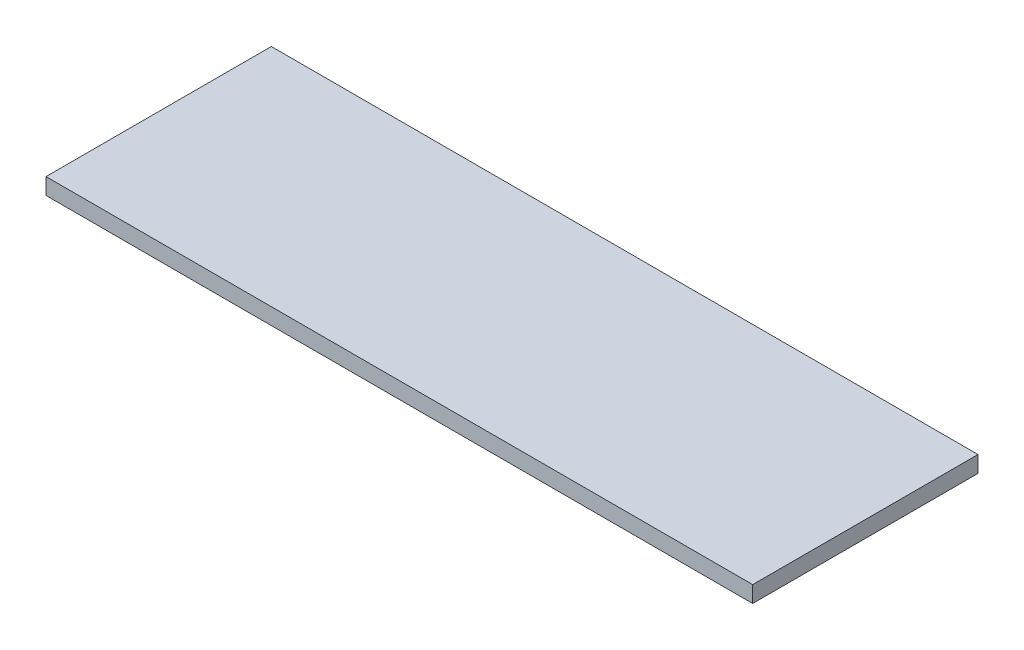
ISO-10303-21;
HEADER;
FILE_DESCRIPTION(('STEP AP214'),'2;1');
FILE_NAME('part.step','',(''),(''),'','','');
FILE_SCHEMA(('AUTOMOTIVE_DESIGN { 1 0 10303 214 1 1 1 1 }'));
ENDSEC;
DATA;
#1=APPLICATION_CONTEXT('core data for automotive mechanical design processes');
#2=APPLICATION_PROTOCOL_DEFINITION('international standard','automotive_design',2000,#1);
#3=PRODUCT_CONTEXT('',#1,'mechanical');
#4=PRODUCT('Part','Part','',(#3));
#5=PRODUCT_RELATED_PRODUCT_CATEGORY('part','',(#4));
#6=PRODUCT_DEFINITION_FORMATION('','',#4);
#7=PRODUCT_DEFINITION_CONTEXT('part definition',#1,'design');
#8=PRODUCT_DEFINITION('design','',#6,#7);
#9=PRODUCT_DEFINITION_SHAPE('','',#8);
#10=(LENGTH_UNIT() NAMED_UNIT(*) SI_UNIT(.MILLI.,.METRE.));
#11=(NAMED_UNIT(*) PLANE_ANGLE_UNIT() SI_UNIT($,.RADIAN.));
#12=(NAMED_UNIT(*) SI_UNIT($,.STERADIAN.) SOLID_ANGLE_UNIT());
#13=UNCERTAINTY_MEASURE_WITH_UNIT(LENGTH_MEASURE(1.E-05),#10,'distance_accuracy_value','');
#14=(GEOMETRIC_REPRESENTATION_CONTEXT(3) GLOBAL_UNCERTAINTY_ASSIGNED_CONTEXT((#13)) GLOBAL_UNIT_ASSIGNED_CONTEXT((#10,
#11,#12)) REPRESENTATION_CONTEXT('',''));
#15=CARTESIAN_POINT('',(0.,0.,0.));
#16=DIRECTION('',(0.,0.,1.));
#17=DIRECTION('',(1.,0.,0.));
#18=AXIS2_PLACEMENT_3D('',#15,#16,#17);
#19=CARTESIAN_POINT('',(0.,1.6,0.));
#20=DIRECTION('',(-1.,0.,0.));
#21=DIRECTION('',(0.,0.,1.));
#22=AXIS2_PLACEMENT_3D('',#19,#20,#21);
#23=PLANE('',#22);
#24=DIRECTION('',(0.,0.,-1.));
#25=VECTOR('',#24,1.);
#26=CARTESIAN_POINT('',(0.,0.,0.));
#27=LINE('',#26,#25);
#28=CARTESIAN_POINT('',(0.,0.,0.));
#29=VERTEX_POINT('',#28);
#30=CARTESIAN_POINT('',(0.,0.,-22.));
#31=VERTEX_POINT('',#30);
#32=EDGE_CURVE('E107',#29,#31,#27,.T.);
#33=ORIENTED_EDGE('',*,*,#32,.T.);
#34=DIRECTION('',(0.,-1.,0.));
#35=VECTOR('',#34,1.);
#36=CARTESIAN_POINT('',(0.,1.6,-22.));
#37=LINE('',#36,#35);
#38=CARTESIAN_POINT('',(0.,1.6,-22.));
#39=VERTEX_POINT('',#38);
#40=EDGE_CURVE('E11',#39,#31,#37,.T.);
#41=ORIENTED_EDGE('',*,*,#40,.F.);
#42=DIRECTION('',(0.,0.,-1.));
#43=VECTOR('',#42,1.);
#44=CARTESIAN_POINT('',(0.,1.6,0.));
#45=LINE('',#44,#43);
#46=CARTESIAN_POINT('',(0.,1.6,0.));
#47=VERTEX_POINT('',#46);
#48=EDGE_CURVE('E91',#47,#39,#45,.T.);
#49=ORIENTED_EDGE('',*,*,#48,.F.);
#50=DIRECTION('',(0.,-1.,0.));
#51=VECTOR('',#50,1.);
#52=CARTESIAN_POINT('',(0.,1.6,0.));
#53=LINE('',#52,#51);
#54=EDGE_CURVE('E103',#47,#29,#53,.T.);
#55=ORIENTED_EDGE('',*,*,#54,.T.);
#56=EDGE_LOOP('',(#33,#41,#49,#55));
#57=FACE_BOUND('',#56,.T.);
#58=ADVANCED_FACE('F39',(#57),#23,.F.);
#59=CARTESIAN_POINT('',(0.,1.6,-22.));
#60=DIRECTION('',(0.,0.,1.));
#61=DIRECTION('',(1.,0.,0.));
#62=AXIS2_PLACEMENT_3D('',#59,#60,#61);
#63=PLANE('',#62);
#64=DIRECTION('',(-1.,0.,0.));
#65=VECTOR('',#64,1.);
#66=CARTESIAN_POINT('',(0.,0.,-22.));
#67=LINE('',#66,#65);
#68=CARTESIAN_POINT('',(-69.,0.,-22.));
#69=VERTEX_POINT('',#68);
#70=EDGE_CURVE('E96',#31,#69,#67,.T.);
#71=ORIENTED_EDGE('',*,*,#70,.T.);
#72=DIRECTION('',(0.,-1.,0.));
#73=VECTOR('',#72,1.);
#74=CARTESIAN_POINT('',(-69.,1.6,-22.));
#75=LINE('',#74,#73);
#76=CARTESIAN_POINT('',(-69.,1.6,-22.));
#77=VERTEX_POINT('',#76);
#78=EDGE_CURVE('E48',#77,#69,#75,.T.);
#79=ORIENTED_EDGE('',*,*,#78,.F.);
#80=DIRECTION('',(-1.,0.,0.));
#81=VECTOR('',#80,1.);
#82=CARTESIAN_POINT('',(0.,1.6,-22.));
#83=LINE('',#82,#81);
#84=EDGE_CURVE('E86',#39,#77,#83,.T.);
#85=ORIENTED_EDGE('',*,*,#84,.F.);
#86=ORIENTED_EDGE('',*,*,#40,.T.);
#87=EDGE_LOOP('',(#71,#79,#85,#86));
#88=FACE_BOUND('',#87,.T.);
#89=ADVANCED_FACE('F95',(#88),#63,.F.);
#90=CARTESIAN_POINT('',(-69.,1.6,0.));
#91=DIRECTION('',(1.,0.,0.));
#92=DIRECTION('',(0.,0.,-1.));
#93=AXIS2_PLACEMENT_3D('',#90,#91,#92);
#94=PLANE('',#93);
#95=DIRECTION('',(0.,0.,1.));
#96=VECTOR('',#95,1.);
#97=CARTESIAN_POINT('',(-69.,0.,0.));
#98=LINE('',#97,#96);
#99=CARTESIAN_POINT('',(-69.,0.,0.));
#100=VERTEX_POINT('',#99);
#101=EDGE_CURVE('E73',#69,#100,#98,.T.);
#102=ORIENTED_EDGE('',*,*,#101,.T.);
#103=DIRECTION('',(0.,-1.,0.));
#104=VECTOR('',#103,1.);
#105=CARTESIAN_POINT('',(-69.,1.6,0.));
#106=LINE('',#105,#104);
#107=CARTESIAN_POINT('',(-69.,1.6,0.));
#108=VERTEX_POINT('',#107);
#109=EDGE_CURVE('E98',#108,#100,#106,.T.);
#110=ORIENTED_EDGE('',*,*,#109,.F.);
#111=DIRECTION('',(0.,0.,1.));
#112=VECTOR('',#111,1.);
#113=CARTESIAN_POINT('',(-69.,1.6,0.));
#114=LINE('',#113,#112);
#115=EDGE_CURVE('E89',#77,#108,#114,.T.);
#116=ORIENTED_EDGE('',*,*,#115,.F.);
#117=ORIENTED_EDGE('',*,*,#78,.T.);
#118=EDGE_LOOP('',(#102,#110,#116,#117));
#119=FACE_BOUND('',#118,.T.);
#120=ADVANCED_FACE('F99',(#119),#94,.F.);
#121=CARTESIAN_POINT('',(0.,1.6,0.));
#122=DIRECTION('',(0.,0.,-1.));
#123=DIRECTION('',(-1.,0.,0.));
#124=AXIS2_PLACEMENT_3D('',#121,#122,#123);
#125=PLANE('',#124);
#126=DIRECTION('',(1.,0.,0.));
#127=VECTOR('',#126,1.);
#128=CARTESIAN_POINT('',(0.,0.,0.));
#129=LINE('',#128,#127);
#130=EDGE_CURVE('E79',#100,#29,#129,.T.);
#131=ORIENTED_EDGE('',*,*,#130,.T.);
#132=ORIENTED_EDGE('',*,*,#54,.F.);
#133=DIRECTION('',(1.,0.,0.));
#134=VECTOR('',#133,1.);
#135=CARTESIAN_POINT('',(0.,1.6,0.));
#136=LINE('',#135,#134);
#137=EDGE_CURVE('E56',#108,#47,#136,.T.);
#138=ORIENTED_EDGE('',*,*,#137,.F.);
#139=ORIENTED_EDGE('',*,*,#109,.T.);
#140=EDGE_LOOP('',(#131,#132,#138,#139));
#141=FACE_BOUND('',#140,.T.);
#142=ADVANCED_FACE('F120',(#141),#125,.F.);
#143=CARTESIAN_POINT('',(0.,1.6,0.));
#144=DIRECTION('',(0.,1.,0.));
#145=DIRECTION('',(0.,0.,1.));
#146=AXIS2_PLACEMENT_3D('',#143,#144,#145);
#147=PLANE('',#146);
#148=ORIENTED_EDGE('',*,*,#48,.T.);
#149=ORIENTED_EDGE('',*,*,#84,.T.);
#150=ORIENTED_EDGE('',*,*,#115,.T.);
#151=ORIENTED_EDGE('',*,*,#137,.T.);
#152=EDGE_LOOP('',(#148,#149,#150,#151));
#153=FACE_BOUND('',#152,.T.);
#154=ADVANCED_FACE('F87',(#153),#147,.T.);
#155=CARTESIAN_POINT('',(0.,0.,0.));
#156=DIRECTION('',(0.,1.,0.));
#157=DIRECTION('',(0.,0.,1.));
#158=AXIS2_PLACEMENT_3D('',#155,#156,#157);
#159=PLANE('',#158);
#160=ORIENTED_EDGE('',*,*,#32,.F.);
#161=ORIENTED_EDGE('',*,*,#130,.F.);
#162=ORIENTED_EDGE('',*,*,#101,.F.);
#163=ORIENTED_EDGE('',*,*,#70,.F.);
#164=EDGE_LOOP('',(#160,#161,#162,#163));
#165=FACE_BOUND('',#164,.T.);
#166=ADVANCED_FACE('F123',(#165),#159,.F.);
#167=CLOSED_SHELL('',(#58,#89,#120,#142,#154,#166));
#168=MANIFOLD_SOLID_BREP('B2',#167);
#169=ADVANCED_BREP_SHAPE_REPRESENTATION('',(#18,#168),#14);
#170=SHAPE_DEFINITION_REPRESENTATION(#9,#169);
ENDSEC;
END-ISO-10303-21;
